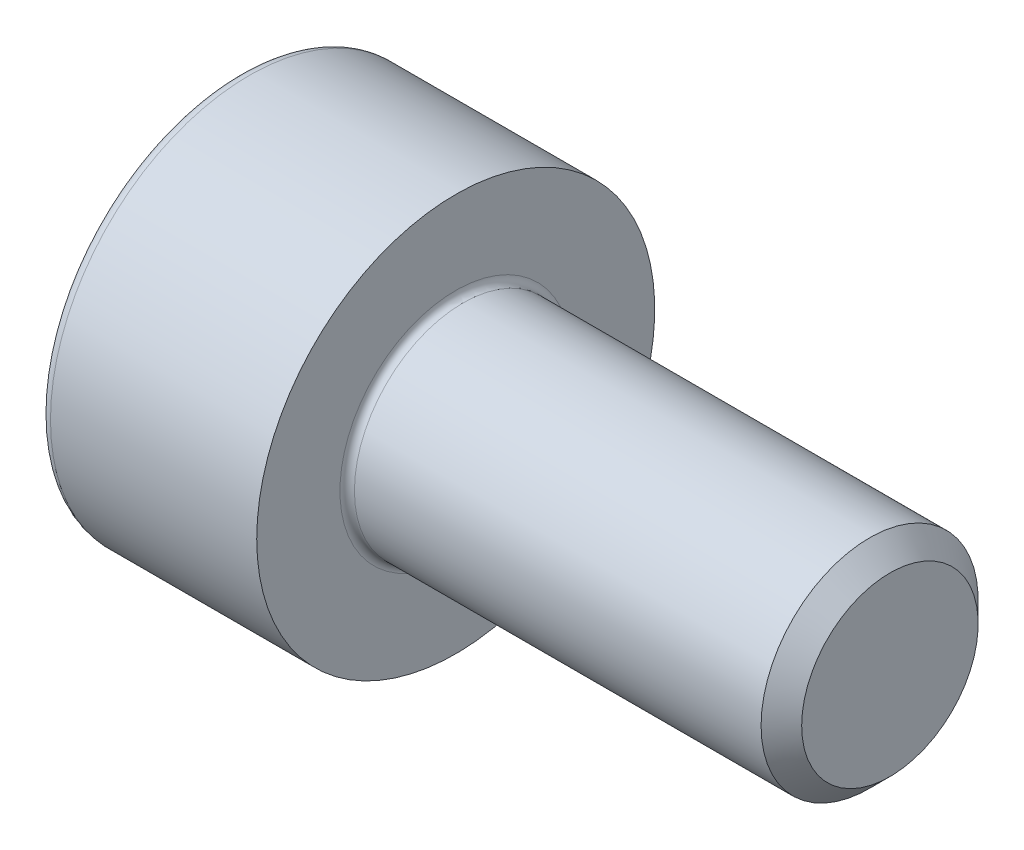
ISO-10303-21;
HEADER;
FILE_DESCRIPTION(('STEP AP214'),'2;1');
FILE_NAME('part.step','',(''),(''),'','','');
FILE_SCHEMA(('AUTOMOTIVE_DESIGN { 1 0 10303 214 1 1 1 1 }'));
ENDSEC;
DATA;
#1=APPLICATION_CONTEXT('core data for automotive mechanical design processes');
#2=APPLICATION_PROTOCOL_DEFINITION('international standard','automotive_design',2000,#1);
#3=PRODUCT_CONTEXT('',#1,'mechanical');
#4=PRODUCT('Part','Part','',(#3));
#5=PRODUCT_RELATED_PRODUCT_CATEGORY('part','',(#4));
#6=PRODUCT_DEFINITION_FORMATION('','',#4);
#7=PRODUCT_DEFINITION_CONTEXT('part definition',#1,'design');
#8=PRODUCT_DEFINITION('design','',#6,#7);
#9=PRODUCT_DEFINITION_SHAPE('','',#8);
#10=(LENGTH_UNIT() NAMED_UNIT(*) SI_UNIT(.MILLI.,.METRE.));
#11=(NAMED_UNIT(*) PLANE_ANGLE_UNIT() SI_UNIT($,.RADIAN.));
#12=(NAMED_UNIT(*) SI_UNIT($,.STERADIAN.) SOLID_ANGLE_UNIT());
#13=UNCERTAINTY_MEASURE_WITH_UNIT(LENGTH_MEASURE(1.E-05),#10,'distance_accuracy_value','');
#14=(GEOMETRIC_REPRESENTATION_CONTEXT(3) GLOBAL_UNCERTAINTY_ASSIGNED_CONTEXT((#13)) GLOBAL_UNIT_ASSIGNED_CONTEXT((#10,
#11,#12)) REPRESENTATION_CONTEXT('',''));
#15=CARTESIAN_POINT('',(0.,0.,0.));
#16=DIRECTION('',(0.,0.,1.));
#17=DIRECTION('',(1.,0.,0.));
#18=AXIS2_PLACEMENT_3D('',#15,#16,#17);
#19=CARTESIAN_POINT('',(0.,0.,0.));
#20=DIRECTION('',(-1.,0.,0.));
#21=DIRECTION('',(0.,0.,1.));
#22=AXIS2_PLACEMENT_3D('',#19,#20,#21);
#23=PLANE('',#22);
#24=DIRECTION('',(0.,-0.499999999999999,0.866025403784439));
#25=VECTOR('',#24,1.);
#26=CARTESIAN_POINT('',(0.,1.47801668912544,0.));
#27=LINE('',#26,#25);
#28=CARTESIAN_POINT('',(0.,1.47801668912544,0.));
#29=VERTEX_POINT('',#28);
#30=CARTESIAN_POINT('',(0.,0.73900834456272,1.28));
#31=VERTEX_POINT('',#30);
#32=EDGE_CURVE('E254',#29,#31,#27,.T.);
#33=ORIENTED_EDGE('',*,*,#32,.T.);
#34=DIRECTION('',(0.,1.,0.));
#35=VECTOR('',#34,1.);
#36=CARTESIAN_POINT('',(0.,-0.739008344562723,1.28));
#37=LINE('',#36,#35);
#38=CARTESIAN_POINT('',(0.,-0.739008344562723,1.28));
#39=VERTEX_POINT('',#38);
#40=EDGE_CURVE('E126',#39,#31,#37,.T.);
#41=ORIENTED_EDGE('',*,*,#40,.F.);
#42=DIRECTION('',(0.,-0.500000000000001,-0.866025403784438));
#43=VECTOR('',#42,1.);
#44=CARTESIAN_POINT('',(0.,-0.739008344562723,1.28));
#45=LINE('',#44,#43);
#46=CARTESIAN_POINT('',(0.,-1.47801668912545,0.));
#47=VERTEX_POINT('',#46);
#48=EDGE_CURVE('E257',#39,#47,#45,.T.);
#49=ORIENTED_EDGE('',*,*,#48,.T.);
#50=DIRECTION('',(0.,0.499999999999999,-0.866025403784439));
#51=VECTOR('',#50,1.);
#52=CARTESIAN_POINT('',(0.,-1.47801668912545,0.));
#53=LINE('',#52,#51);
#54=CARTESIAN_POINT('',(0.,-0.739008344562726,-1.28));
#55=VERTEX_POINT('',#54);
#56=EDGE_CURVE('E260',#47,#55,#53,.T.);
#57=ORIENTED_EDGE('',*,*,#56,.T.);
#58=DIRECTION('',(0.,-1.,0.));
#59=VECTOR('',#58,1.);
#60=CARTESIAN_POINT('',(0.,0.739008344562715,-1.28));
#61=LINE('',#60,#59);
#62=CARTESIAN_POINT('',(0.,0.739008344562715,-1.28));
#63=VERTEX_POINT('',#62);
#64=EDGE_CURVE('E263',#63,#55,#61,.T.);
#65=ORIENTED_EDGE('',*,*,#64,.F.);
#66=DIRECTION('',(0.,-0.500000000000002,-0.866025403784437));
#67=VECTOR('',#66,1.);
#68=CARTESIAN_POINT('',(0.,1.47801668912544,0.));
#69=LINE('',#68,#67);
#70=EDGE_CURVE('E121',#29,#63,#69,.T.);
#71=ORIENTED_EDGE('',*,*,#70,.F.);
#72=EDGE_LOOP('',(#33,#41,#49,#57,#65,#71));
#73=FACE_BOUND('',#72,.T.);
#74=CARTESIAN_POINT('',(0.,0.,0.));
#75=DIRECTION('',(-1.,0.,0.));
#76=DIRECTION('',(0.,0.,1.));
#77=AXIS2_PLACEMENT_3D('',#74,#75,#76);
#78=CIRCLE('',#77,2.6);
#79=CARTESIAN_POINT('',(0.,0.,2.6));
#80=VERTEX_POINT('',#79);
#81=EDGE_CURVE('E38',#80,#80,#78,.T.);
#82=ORIENTED_EDGE('',*,*,#81,.T.);
#83=EDGE_LOOP('',(#82));
#84=FACE_BOUND('',#83,.T.);
#85=ADVANCED_FACE('F30',(#73,#84),#23,.T.);
#86=CARTESIAN_POINT('',(-31.75,0.,0.));
#87=DIRECTION('',(-1.,0.,0.));
#88=DIRECTION('',(0.,0.,1.));
#89=AXIS2_PLACEMENT_3D('',#86,#87,#88);
#90=CYLINDRICAL_SURFACE('',#89,2.75);
#91=CARTESIAN_POINT('',(0.149999999999997,0.,0.));
#92=DIRECTION('',(-1.,0.,0.));
#93=DIRECTION('',(0.,0.,1.));
#94=AXIS2_PLACEMENT_3D('',#91,#92,#93);
#95=CIRCLE('',#94,2.75);
#96=CARTESIAN_POINT('',(0.149999999999997,0.,2.75));
#97=VERTEX_POINT('',#96);
#98=EDGE_CURVE('E11',#97,#97,#95,.F.);
#99=ORIENTED_EDGE('',*,*,#98,.T.);
#100=EDGE_LOOP('',(#99));
#101=FACE_BOUND('',#100,.T.);
#102=CARTESIAN_POINT('',(3.,0.,0.));
#103=DIRECTION('',(-1.,0.,0.));
#104=DIRECTION('',(0.,0.,1.));
#105=AXIS2_PLACEMENT_3D('',#102,#103,#104);
#106=CIRCLE('',#105,2.75);
#107=CARTESIAN_POINT('',(3.,0.,2.75));
#108=VERTEX_POINT('',#107);
#109=EDGE_CURVE('E144',#108,#108,#106,.T.);
#110=ORIENTED_EDGE('',*,*,#109,.T.);
#111=EDGE_LOOP('',(#110));
#112=FACE_BOUND('',#111,.T.);
#113=ADVANCED_FACE('F168',(#101,#112),#90,.T.);
#114=CARTESIAN_POINT('',(3.,2.75,0.));
#115=DIRECTION('',(1.,0.,0.));
#116=DIRECTION('',(0.,0.,-1.));
#117=AXIS2_PLACEMENT_3D('',#114,#115,#116);
#118=PLANE('',#117);
#119=CARTESIAN_POINT('',(3.,0.,0.));
#120=DIRECTION('',(1.,0.,0.));
#121=DIRECTION('',(0.,0.,-1.));
#122=AXIS2_PLACEMENT_3D('',#119,#120,#121);
#123=CIRCLE('',#122,1.6);
#124=CARTESIAN_POINT('',(3.,0.,-1.6));
#125=VERTEX_POINT('',#124);
#126=EDGE_CURVE('E147',#125,#125,#123,.F.);
#127=ORIENTED_EDGE('',*,*,#126,.T.);
#128=EDGE_LOOP('',(#127));
#129=FACE_BOUND('',#128,.T.);
#130=ORIENTED_EDGE('',*,*,#109,.F.);
#131=EDGE_LOOP('',(#130));
#132=FACE_BOUND('',#131,.T.);
#133=ADVANCED_FACE('F174',(#129,#132),#118,.T.);
#134=CARTESIAN_POINT('',(-31.75,0.,0.));
#135=DIRECTION('',(-1.,0.,0.));
#136=DIRECTION('',(0.,0.,1.));
#137=AXIS2_PLACEMENT_3D('',#134,#135,#136);
#138=CYLINDRICAL_SURFACE('',#137,1.5);
#139=CARTESIAN_POINT('',(3.10000000000001,0.,0.));
#140=DIRECTION('',(1.,0.,0.));
#141=DIRECTION('',(0.,0.,-1.));
#142=AXIS2_PLACEMENT_3D('',#139,#140,#141);
#143=CIRCLE('',#142,1.5);
#144=CARTESIAN_POINT('',(3.10000000000001,0.,-1.5));
#145=VERTEX_POINT('',#144);
#146=EDGE_CURVE('E150',#145,#145,#143,.T.);
#147=ORIENTED_EDGE('',*,*,#146,.T.);
#148=EDGE_LOOP('',(#147));
#149=FACE_BOUND('',#148,.T.);
#150=CARTESIAN_POINT('',(8.71949999999999,0.,0.));
#151=DIRECTION('',(-1.,0.,0.));
#152=DIRECTION('',(0.,0.,1.));
#153=AXIS2_PLACEMENT_3D('',#150,#151,#152);
#154=CIRCLE('',#153,1.5);
#155=CARTESIAN_POINT('',(8.71949999999999,0.,1.5));
#156=VERTEX_POINT('',#155);
#157=EDGE_CURVE('E141',#156,#156,#154,.T.);
#158=ORIENTED_EDGE('',*,*,#157,.T.);
#159=EDGE_LOOP('',(#158));
#160=FACE_BOUND('',#159,.T.);
#161=ADVANCED_FACE('F180',(#149,#160),#138,.T.);
#162=CARTESIAN_POINT('',(8.99999999999998,0.,0.));
#163=DIRECTION('',(-1.,0.,0.));
#164=DIRECTION('',(0.,0.,1.));
#165=AXIS2_PLACEMENT_3D('',#162,#163,#164);
#166=CONICAL_SURFACE('',#165,1.2195,0.785398163397467);
#167=ORIENTED_EDGE('',*,*,#157,.F.);
#168=EDGE_LOOP('',(#167));
#169=FACE_BOUND('',#168,.T.);
#170=CARTESIAN_POINT('',(8.99999999999998,0.,0.));
#171=DIRECTION('',(-1.,0.,0.));
#172=DIRECTION('',(0.,0.,1.));
#173=AXIS2_PLACEMENT_3D('',#170,#171,#172);
#174=CIRCLE('',#173,1.2195);
#175=CARTESIAN_POINT('',(8.99999999999998,0.,1.2195));
#176=VERTEX_POINT('',#175);
#177=EDGE_CURVE('E137',#176,#176,#174,.T.);
#178=ORIENTED_EDGE('',*,*,#177,.T.);
#179=EDGE_LOOP('',(#178));
#180=FACE_BOUND('',#179,.T.);
#181=ADVANCED_FACE('F184',(#169,#180),#166,.T.);
#182=CARTESIAN_POINT('',(8.99999999999998,1.2195,0.));
#183=DIRECTION('',(1.,0.,0.));
#184=DIRECTION('',(0.,0.,-1.));
#185=AXIS2_PLACEMENT_3D('',#182,#183,#184);
#186=PLANE('',#185);
#187=ORIENTED_EDGE('',*,*,#177,.F.);
#188=EDGE_LOOP('',(#187));
#189=FACE_BOUND('',#188,.T.);
#190=ADVANCED_FACE('F164',(#189),#186,.T.);
#191=CARTESIAN_POINT('',(3.10000000000001,0.,0.));
#192=DIRECTION('',(1.,0.,0.));
#193=DIRECTION('',(0.,0.,-1.));
#194=AXIS2_PLACEMENT_3D('',#191,#192,#193);
#195=TOROIDAL_SURFACE('',#194,1.6,0.1);
#196=ORIENTED_EDGE('',*,*,#146,.F.);
#197=EDGE_LOOP('',(#196));
#198=FACE_BOUND('',#197,.T.);
#199=ORIENTED_EDGE('',*,*,#126,.F.);
#200=EDGE_LOOP('',(#199));
#201=FACE_BOUND('',#200,.T.);
#202=ADVANCED_FACE('F157',(#198,#201),#195,.F.);
#203=CARTESIAN_POINT('',(0.149999999999997,0.,0.));
#204=DIRECTION('',(-1.,0.,0.));
#205=DIRECTION('',(0.,0.,1.));
#206=AXIS2_PLACEMENT_3D('',#203,#204,#205);
#207=TOROIDAL_SURFACE('',#206,2.6,0.15);
#208=ORIENTED_EDGE('',*,*,#98,.F.);
#209=EDGE_LOOP('',(#208));
#210=FACE_BOUND('',#209,.T.);
#211=ORIENTED_EDGE('',*,*,#81,.F.);
#212=EDGE_LOOP('',(#211));
#213=FACE_BOUND('',#212,.T.);
#214=ADVANCED_FACE('F32',(#210,#213),#207,.T.);
#215=CARTESIAN_POINT('',(1.3,1.47801668912544,0.));
#216=DIRECTION('',(0.,-0.866025403784439,-0.499999999999999));
#217=DIRECTION('',(0.,0.499999999999999,-0.866025403784439));
#218=AXIS2_PLACEMENT_3D('',#215,#216,#217);
#219=PLANE('',#218);
#220=ORIENTED_EDGE('',*,*,#32,.F.);
#221=DIRECTION('',(-1.,0.,0.));
#222=VECTOR('',#221,1.);
#223=CARTESIAN_POINT('',(1.3,1.47801668912544,0.));
#224=LINE('',#223,#222);
#225=CARTESIAN_POINT('',(1.3,1.47801668912544,0.));
#226=VERTEX_POINT('',#225);
#227=EDGE_CURVE('E244',#226,#29,#224,.T.);
#228=ORIENTED_EDGE('',*,*,#227,.F.);
#229=DIRECTION('',(0.,-0.499999999999999,0.866025403784439));
#230=VECTOR('',#229,1.);
#231=CARTESIAN_POINT('',(1.3,1.47801668912544,0.));
#232=LINE('',#231,#230);
#233=CARTESIAN_POINT('',(1.3,1.10851251684408,0.639999999999997));
#234=VERTEX_POINT('',#233);
#235=EDGE_CURVE('E113',#226,#234,#232,.T.);
#236=ORIENTED_EDGE('',*,*,#235,.T.);
#237=CARTESIAN_POINT('',(1.3,0.73900834456272,1.28));
#238=VERTEX_POINT('',#237);
#239=EDGE_CURVE('E104',#234,#238,#232,.T.);
#240=ORIENTED_EDGE('',*,*,#239,.T.);
#241=DIRECTION('',(-1.,0.,0.));
#242=VECTOR('',#241,1.);
#243=CARTESIAN_POINT('',(1.3,0.73900834456272,1.28));
#244=LINE('',#243,#242);
#245=EDGE_CURVE('E118',#238,#31,#244,.T.);
#246=ORIENTED_EDGE('',*,*,#245,.T.);
#247=EDGE_LOOP('',(#220,#228,#236,#240,#246));
#248=FACE_BOUND('',#247,.T.);
#249=ADVANCED_FACE('F117',(#248),#219,.T.);
#250=CARTESIAN_POINT('',(1.3,-0.739008344562723,1.28));
#251=DIRECTION('',(0.,0.,1.));
#252=DIRECTION('',(0.,-1.,0.));
#253=AXIS2_PLACEMENT_3D('',#250,#251,#252);
#254=PLANE('',#253);
#255=ORIENTED_EDGE('',*,*,#40,.T.);
#256=ORIENTED_EDGE('',*,*,#245,.F.);
#257=DIRECTION('',(0.,1.,0.));
#258=VECTOR('',#257,1.);
#259=CARTESIAN_POINT('',(1.3,-0.739008344562723,1.28));
#260=LINE('',#259,#258);
#261=CARTESIAN_POINT('',(1.3,0.,1.28));
#262=VERTEX_POINT('',#261);
#263=EDGE_CURVE('E101',#262,#238,#260,.T.);
#264=ORIENTED_EDGE('',*,*,#263,.F.);
#265=CARTESIAN_POINT('',(1.3,-0.739008344562723,1.28));
#266=VERTEX_POINT('',#265);
#267=EDGE_CURVE('E112',#266,#262,#260,.T.);
#268=ORIENTED_EDGE('',*,*,#267,.F.);
#269=DIRECTION('',(-1.,0.,0.));
#270=VECTOR('',#269,1.);
#271=CARTESIAN_POINT('',(1.3,-0.739008344562723,1.28));
#272=LINE('',#271,#270);
#273=EDGE_CURVE('E128',#266,#39,#272,.T.);
#274=ORIENTED_EDGE('',*,*,#273,.T.);
#275=EDGE_LOOP('',(#255,#256,#264,#268,#274));
#276=FACE_BOUND('',#275,.T.);
#277=ADVANCED_FACE('F123',(#276),#254,.F.);
#278=CARTESIAN_POINT('',(1.3,-0.739008344562723,1.28));
#279=DIRECTION('',(0.,0.866025403784438,-0.500000000000001));
#280=DIRECTION('',(0.,0.500000000000001,0.866025403784438));
#281=AXIS2_PLACEMENT_3D('',#278,#279,#280);
#282=PLANE('',#281);
#283=ORIENTED_EDGE('',*,*,#48,.F.);
#284=ORIENTED_EDGE('',*,*,#273,.F.);
#285=DIRECTION('',(0.,-0.500000000000001,-0.866025403784438));
#286=VECTOR('',#285,1.);
#287=CARTESIAN_POINT('',(1.3,-0.739008344562723,1.28));
#288=LINE('',#287,#286);
#289=CARTESIAN_POINT('',(1.3,-1.10851251684408,0.640000000000002));
#290=VERTEX_POINT('',#289);
#291=EDGE_CURVE('E283',#266,#290,#288,.T.);
#292=ORIENTED_EDGE('',*,*,#291,.T.);
#293=CARTESIAN_POINT('',(1.3,-1.47801668912545,0.));
#294=VERTEX_POINT('',#293);
#295=EDGE_CURVE('E272',#290,#294,#288,.T.);
#296=ORIENTED_EDGE('',*,*,#295,.T.);
#297=DIRECTION('',(-1.,0.,0.));
#298=VECTOR('',#297,1.);
#299=CARTESIAN_POINT('',(1.3,-1.47801668912545,0.));
#300=LINE('',#299,#298);
#301=EDGE_CURVE('E133',#294,#47,#300,.T.);
#302=ORIENTED_EDGE('',*,*,#301,.T.);
#303=EDGE_LOOP('',(#283,#284,#292,#296,#302));
#304=FACE_BOUND('',#303,.T.);
#305=ADVANCED_FACE('F198',(#304),#282,.T.);
#306=CARTESIAN_POINT('',(1.3,-1.47801668912545,0.));
#307=DIRECTION('',(0.,0.866025403784439,0.499999999999999));
#308=DIRECTION('',(0.,-0.499999999999999,0.866025403784439));
#309=AXIS2_PLACEMENT_3D('',#306,#307,#308);
#310=PLANE('',#309);
#311=ORIENTED_EDGE('',*,*,#56,.F.);
#312=ORIENTED_EDGE('',*,*,#301,.F.);
#313=DIRECTION('',(0.,0.499999999999999,-0.866025403784439));
#314=VECTOR('',#313,1.);
#315=CARTESIAN_POINT('',(1.3,-1.47801668912545,0.));
#316=LINE('',#315,#314);
#317=CARTESIAN_POINT('',(1.3,-1.10851251684409,-0.640000000000002));
#318=VERTEX_POINT('',#317);
#319=EDGE_CURVE('E250',#294,#318,#316,.T.);
#320=ORIENTED_EDGE('',*,*,#319,.T.);
#321=CARTESIAN_POINT('',(1.3,-0.739008344562726,-1.28));
#322=VERTEX_POINT('',#321);
#323=EDGE_CURVE('E282',#318,#322,#316,.T.);
#324=ORIENTED_EDGE('',*,*,#323,.T.);
#325=DIRECTION('',(-1.,0.,0.));
#326=VECTOR('',#325,1.);
#327=CARTESIAN_POINT('',(1.3,-0.739008344562726,-1.28));
#328=LINE('',#327,#326);
#329=EDGE_CURVE('E243',#322,#55,#328,.T.);
#330=ORIENTED_EDGE('',*,*,#329,.T.);
#331=EDGE_LOOP('',(#311,#312,#320,#324,#330));
#332=FACE_BOUND('',#331,.T.);
#333=ADVANCED_FACE('F201',(#332),#310,.T.);
#334=CARTESIAN_POINT('',(1.3,0.739008344562715,-1.28));
#335=DIRECTION('',(0.,0.,-1.));
#336=DIRECTION('',(0.,1.,0.));
#337=AXIS2_PLACEMENT_3D('',#334,#335,#336);
#338=PLANE('',#337);
#339=ORIENTED_EDGE('',*,*,#64,.T.);
#340=ORIENTED_EDGE('',*,*,#329,.F.);
#341=DIRECTION('',(0.,-1.,0.));
#342=VECTOR('',#341,1.);
#343=CARTESIAN_POINT('',(1.3,0.739008344562715,-1.28));
#344=LINE('',#343,#342);
#345=CARTESIAN_POINT('',(1.3,0.,-1.28));
#346=VERTEX_POINT('',#345);
#347=EDGE_CURVE('E247',#346,#322,#344,.T.);
#348=ORIENTED_EDGE('',*,*,#347,.F.);
#349=CARTESIAN_POINT('',(1.3,0.739008344562715,-1.28));
#350=VERTEX_POINT('',#349);
#351=EDGE_CURVE('E45',#350,#346,#344,.T.);
#352=ORIENTED_EDGE('',*,*,#351,.F.);
#353=DIRECTION('',(-1.,0.,0.));
#354=VECTOR('',#353,1.);
#355=CARTESIAN_POINT('',(1.3,0.739008344562715,-1.28));
#356=LINE('',#355,#354);
#357=EDGE_CURVE('E240',#350,#63,#356,.T.);
#358=ORIENTED_EDGE('',*,*,#357,.T.);
#359=EDGE_LOOP('',(#339,#340,#348,#352,#358));
#360=FACE_BOUND('',#359,.T.);
#361=ADVANCED_FACE('F205',(#360),#338,.F.);
#362=CARTESIAN_POINT('',(1.3,1.47801668912544,0.));
#363=DIRECTION('',(0.,0.866025403784437,-0.500000000000002));
#364=DIRECTION('',(0.,0.500000000000002,0.866025403784437));
#365=AXIS2_PLACEMENT_3D('',#362,#363,#364);
#366=PLANE('',#365);
#367=ORIENTED_EDGE('',*,*,#70,.T.);
#368=ORIENTED_EDGE('',*,*,#357,.F.);
#369=DIRECTION('',(0.,-0.500000000000002,-0.866025403784437));
#370=VECTOR('',#369,1.);
#371=CARTESIAN_POINT('',(1.3,1.47801668912544,0.));
#372=LINE('',#371,#370);
#373=CARTESIAN_POINT('',(1.3,1.10851251684408,-0.640000000000002));
#374=VERTEX_POINT('',#373);
#375=EDGE_CURVE('E230',#374,#350,#372,.T.);
#376=ORIENTED_EDGE('',*,*,#375,.F.);
#377=EDGE_CURVE('E236',#226,#374,#372,.T.);
#378=ORIENTED_EDGE('',*,*,#377,.F.);
#379=ORIENTED_EDGE('',*,*,#227,.T.);
#380=EDGE_LOOP('',(#367,#368,#376,#378,#379));
#381=FACE_BOUND('',#380,.T.);
#382=ADVANCED_FACE('F209',(#381),#366,.F.);
#383=CARTESIAN_POINT('',(1.3,1.47801668912544,0.));
#384=DIRECTION('',(1.,0.,0.));
#385=DIRECTION('',(0.,0.,-1.));
#386=AXIS2_PLACEMENT_3D('',#383,#384,#385);
#387=PLANE('',#386);
#388=ORIENTED_EDGE('',*,*,#347,.T.);
#389=ORIENTED_EDGE('',*,*,#323,.F.);
#390=CARTESIAN_POINT('',(1.3,0.,0.));
#391=DIRECTION('',(-1.,0.,0.));
#392=DIRECTION('',(0.,0.,1.));
#393=AXIS2_PLACEMENT_3D('',#390,#391,#392);
#394=CIRCLE('',#393,1.28);
#395=EDGE_CURVE('E278',#346,#318,#394,.T.);
#396=ORIENTED_EDGE('',*,*,#395,.F.);
#397=EDGE_LOOP('',(#388,#389,#396));
#398=FACE_BOUND('',#397,.T.);
#399=ADVANCED_FACE('F213',(#398),#387,.F.);
#400=ORIENTED_EDGE('',*,*,#319,.F.);
#401=ORIENTED_EDGE('',*,*,#295,.F.);
#402=EDGE_CURVE('E131',#318,#290,#394,.T.);
#403=ORIENTED_EDGE('',*,*,#402,.F.);
#404=EDGE_LOOP('',(#400,#401,#403));
#405=FACE_BOUND('',#404,.T.);
#406=ADVANCED_FACE('F216',(#405),#387,.F.);
#407=ORIENTED_EDGE('',*,*,#291,.F.);
#408=ORIENTED_EDGE('',*,*,#267,.T.);
#409=EDGE_CURVE('E127',#290,#262,#394,.T.);
#410=ORIENTED_EDGE('',*,*,#409,.F.);
#411=EDGE_LOOP('',(#407,#408,#410));
#412=FACE_BOUND('',#411,.T.);
#413=ADVANCED_FACE('F221',(#412),#387,.F.);
#414=ORIENTED_EDGE('',*,*,#263,.T.);
#415=ORIENTED_EDGE('',*,*,#239,.F.);
#416=EDGE_CURVE('E107',#262,#234,#394,.T.);
#417=ORIENTED_EDGE('',*,*,#416,.F.);
#418=EDGE_LOOP('',(#414,#415,#417));
#419=FACE_BOUND('',#418,.T.);
#420=ADVANCED_FACE('F103',(#419),#387,.F.);
#421=ORIENTED_EDGE('',*,*,#235,.F.);
#422=ORIENTED_EDGE('',*,*,#377,.T.);
#423=EDGE_CURVE('E138',#234,#374,#394,.T.);
#424=ORIENTED_EDGE('',*,*,#423,.F.);
#425=EDGE_LOOP('',(#421,#422,#424));
#426=FACE_BOUND('',#425,.T.);
#427=ADVANCED_FACE('F224',(#426),#387,.F.);
#428=ORIENTED_EDGE('',*,*,#375,.T.);
#429=ORIENTED_EDGE('',*,*,#351,.T.);
#430=EDGE_CURVE('E233',#374,#346,#394,.T.);
#431=ORIENTED_EDGE('',*,*,#430,.F.);
#432=EDGE_LOOP('',(#428,#429,#431));
#433=FACE_BOUND('',#432,.T.);
#434=ADVANCED_FACE('F194',(#433),#387,.F.);
#435=CARTESIAN_POINT('',(1.3,0.,0.));
#436=DIRECTION('',(-1.,0.,0.));
#437=DIRECTION('',(0.,0.,1.));
#438=AXIS2_PLACEMENT_3D('',#435,#436,#437);
#439=CONICAL_SURFACE('',#438,1.28,1.04719755119659);
#440=CARTESIAN_POINT('',(2.03900834456273,0.,0.));
#441=VERTEX_POINT('',#440);
#442=VERTEX_LOOP('',#441);
#443=FACE_BOUND('',#442,.T.);
#444=ORIENTED_EDGE('',*,*,#416,.T.);
#445=ORIENTED_EDGE('',*,*,#423,.T.);
#446=ORIENTED_EDGE('',*,*,#430,.T.);
#447=ORIENTED_EDGE('',*,*,#395,.T.);
#448=ORIENTED_EDGE('',*,*,#402,.T.);
#449=ORIENTED_EDGE('',*,*,#409,.T.);
#450=EDGE_LOOP('',(#444,#445,#446,#447,#448,#449));
#451=FACE_BOUND('',#450,.T.);
#452=ADVANCED_FACE('F192',(#443,#451),#439,.F.);
#453=CLOSED_SHELL('',(#85,#113,#133,#161,#181,#190,#202,#214,#249,#277,#305,#333,#361,#382,#399,
#406,#413,#420,#427,#434,#452));
#454=MANIFOLD_SOLID_BREP('B2',#453);
#455=ADVANCED_BREP_SHAPE_REPRESENTATION('',(#18,#454),#14);
#456=SHAPE_DEFINITION_REPRESENTATION(#9,#455);
ENDSEC;
END-ISO-10303-21;
